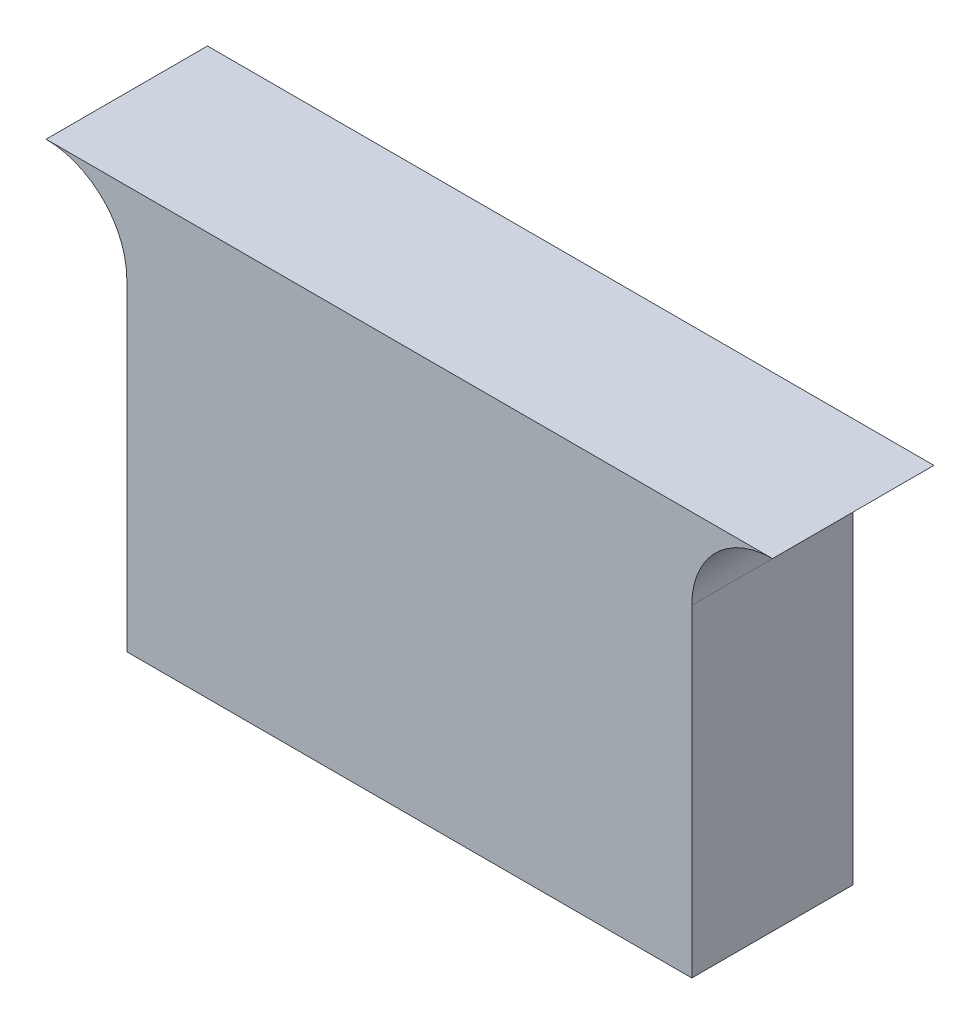
ISO-10303-21;
HEADER;
FILE_DESCRIPTION(('STEP AP214'),'2;1');
FILE_NAME('part.step','',(''),(''),'','','');
FILE_SCHEMA(('AUTOMOTIVE_DESIGN { 1 0 10303 214 1 1 1 1 }'));
ENDSEC;
DATA;
#1=APPLICATION_CONTEXT('core data for automotive mechanical design processes');
#2=APPLICATION_PROTOCOL_DEFINITION('international standard','automotive_design',2000,#1);
#3=PRODUCT_CONTEXT('',#1,'mechanical');
#4=PRODUCT('Part','Part','',(#3));
#5=PRODUCT_RELATED_PRODUCT_CATEGORY('part','',(#4));
#6=PRODUCT_DEFINITION_FORMATION('','',#4);
#7=PRODUCT_DEFINITION_CONTEXT('part definition',#1,'design');
#8=PRODUCT_DEFINITION('design','',#6,#7);
#9=PRODUCT_DEFINITION_SHAPE('','',#8);
#10=(LENGTH_UNIT() NAMED_UNIT(*) SI_UNIT(.MILLI.,.METRE.));
#11=(NAMED_UNIT(*) PLANE_ANGLE_UNIT() SI_UNIT($,.RADIAN.));
#12=(NAMED_UNIT(*) SI_UNIT($,.STERADIAN.) SOLID_ANGLE_UNIT());
#13=UNCERTAINTY_MEASURE_WITH_UNIT(LENGTH_MEASURE(1.E-05),#10,'distance_accuracy_value','');
#14=(GEOMETRIC_REPRESENTATION_CONTEXT(3) GLOBAL_UNCERTAINTY_ASSIGNED_CONTEXT((#13)) GLOBAL_UNIT_ASSIGNED_CONTEXT((#10,
#11,#12)) REPRESENTATION_CONTEXT('',''));
#15=CARTESIAN_POINT('',(0.,0.,0.));
#16=DIRECTION('',(0.,0.,1.));
#17=DIRECTION('',(1.,0.,0.));
#18=AXIS2_PLACEMENT_3D('',#15,#16,#17);
#19=CARTESIAN_POINT('',(0.,2.00000000000001,4.));
#20=DIRECTION('',(0.,-1.,0.));
#21=DIRECTION('',(1.,0.,0.));
#22=AXIS2_PLACEMENT_3D('',#19,#20,#21);
#23=PLANE('',#22);
#24=DIRECTION('',(-1.,0.,0.));
#25=VECTOR('',#24,1.);
#26=CARTESIAN_POINT('',(0.,2.00000000000001,0.));
#27=LINE('',#26,#25);
#28=CARTESIAN_POINT('',(0.,2.00000000000001,0.));
#29=VERTEX_POINT('',#28);
#30=CARTESIAN_POINT('',(-18.,2.,0.));
#31=VERTEX_POINT('',#30);
#32=EDGE_CURVE('E117',#29,#31,#27,.T.);
#33=ORIENTED_EDGE('',*,*,#32,.T.);
#34=DIRECTION('',(0.,0.,-1.));
#35=VECTOR('',#34,1.);
#36=CARTESIAN_POINT('',(-18.,2.,4.));
#37=LINE('',#36,#35);
#38=CARTESIAN_POINT('',(-18.,2.,4.));
#39=VERTEX_POINT('',#38);
#40=EDGE_CURVE('E11',#39,#31,#37,.T.);
#41=ORIENTED_EDGE('',*,*,#40,.F.);
#42=DIRECTION('',(-1.,0.,0.));
#43=VECTOR('',#42,1.);
#44=CARTESIAN_POINT('',(0.,2.00000000000001,4.));
#45=LINE('',#44,#43);
#46=CARTESIAN_POINT('',(0.,2.00000000000001,4.));
#47=VERTEX_POINT('',#46);
#48=EDGE_CURVE('E130',#47,#39,#45,.T.);
#49=ORIENTED_EDGE('',*,*,#48,.F.);
#50=DIRECTION('',(0.,0.,-1.));
#51=VECTOR('',#50,1.);
#52=CARTESIAN_POINT('',(0.,2.00000000000001,4.));
#53=LINE('',#52,#51);
#54=EDGE_CURVE('E49',#47,#29,#53,.T.);
#55=ORIENTED_EDGE('',*,*,#54,.T.);
#56=EDGE_LOOP('',(#33,#41,#49,#55));
#57=FACE_BOUND('',#56,.T.);
#58=ADVANCED_FACE('F33',(#57),#23,.F.);
#59=CARTESIAN_POINT('',(-18.,0.,4.));
#60=DIRECTION('',(0.,0.,-1.));
#61=DIRECTION('',(-1.,0.,0.));
#62=AXIS2_PLACEMENT_3D('',#59,#60,#61);
#63=CYLINDRICAL_SURFACE('',#62,2.);
#64=CARTESIAN_POINT('',(-18.,0.,0.));
#65=DIRECTION('',(0.,0.,-1.));
#66=DIRECTION('',(-1.,0.,0.));
#67=AXIS2_PLACEMENT_3D('',#64,#65,#66);
#68=CIRCLE('',#67,2.);
#69=CARTESIAN_POINT('',(-16.,0.,0.));
#70=VERTEX_POINT('',#69);
#71=EDGE_CURVE('E119',#31,#70,#68,.T.);
#72=ORIENTED_EDGE('',*,*,#71,.T.);
#73=DIRECTION('',(0.,0.,-1.));
#74=VECTOR('',#73,1.);
#75=CARTESIAN_POINT('',(-16.,0.,4.));
#76=LINE('',#75,#74);
#77=CARTESIAN_POINT('',(-16.,0.,4.));
#78=VERTEX_POINT('',#77);
#79=EDGE_CURVE('E41',#78,#70,#76,.T.);
#80=ORIENTED_EDGE('',*,*,#79,.F.);
#81=CARTESIAN_POINT('',(-18.,0.,4.));
#82=DIRECTION('',(0.,0.,-1.));
#83=DIRECTION('',(-1.,0.,0.));
#84=AXIS2_PLACEMENT_3D('',#81,#82,#83);
#85=CIRCLE('',#84,2.);
#86=EDGE_CURVE('E81',#39,#78,#85,.T.);
#87=ORIENTED_EDGE('',*,*,#86,.F.);
#88=ORIENTED_EDGE('',*,*,#40,.T.);
#89=EDGE_LOOP('',(#72,#80,#87,#88));
#90=FACE_BOUND('',#89,.T.);
#91=ADVANCED_FACE('F150',(#90),#63,.F.);
#92=CARTESIAN_POINT('',(-16.,0.,4.));
#93=DIRECTION('',(1.,0.,0.));
#94=DIRECTION('',(0.,0.,-1.));
#95=AXIS2_PLACEMENT_3D('',#92,#93,#94);
#96=PLANE('',#95);
#97=DIRECTION('',(0.,-1.,0.));
#98=VECTOR('',#97,1.);
#99=CARTESIAN_POINT('',(-16.,0.,0.));
#100=LINE('',#99,#98);
#101=CARTESIAN_POINT('',(-16.,-8.,0.));
#102=VERTEX_POINT('',#101);
#103=EDGE_CURVE('E121',#70,#102,#100,.T.);
#104=ORIENTED_EDGE('',*,*,#103,.T.);
#105=DIRECTION('',(0.,0.,-1.));
#106=VECTOR('',#105,1.);
#107=CARTESIAN_POINT('',(-16.,-8.,4.));
#108=LINE('',#107,#106);
#109=CARTESIAN_POINT('',(-16.,-8.,4.));
#110=VERTEX_POINT('',#109);
#111=EDGE_CURVE('E100',#110,#102,#108,.T.);
#112=ORIENTED_EDGE('',*,*,#111,.F.);
#113=DIRECTION('',(0.,-1.,0.));
#114=VECTOR('',#113,1.);
#115=CARTESIAN_POINT('',(-16.,0.,4.));
#116=LINE('',#115,#114);
#117=EDGE_CURVE('E108',#78,#110,#116,.T.);
#118=ORIENTED_EDGE('',*,*,#117,.F.);
#119=ORIENTED_EDGE('',*,*,#79,.T.);
#120=EDGE_LOOP('',(#104,#112,#118,#119));
#121=FACE_BOUND('',#120,.T.);
#122=ADVANCED_FACE('F136',(#121),#96,.F.);
#123=CARTESIAN_POINT('',(-2.,-8.,4.));
#124=DIRECTION('',(0.,-1.,0.));
#125=DIRECTION('',(1.,0.,0.));
#126=AXIS2_PLACEMENT_3D('',#123,#124,#125);
#127=PLANE('',#126);
#128=DIRECTION('',(-1.,0.,0.));
#129=VECTOR('',#128,1.);
#130=CARTESIAN_POINT('',(-2.,-8.,0.));
#131=LINE('',#130,#129);
#132=CARTESIAN_POINT('',(-2.,-8.,0.));
#133=VERTEX_POINT('',#132);
#134=EDGE_CURVE('E96',#133,#102,#131,.T.);
#135=ORIENTED_EDGE('',*,*,#134,.F.);
#136=DIRECTION('',(0.,0.,-1.));
#137=VECTOR('',#136,1.);
#138=CARTESIAN_POINT('',(-2.,-8.,4.));
#139=LINE('',#138,#137);
#140=CARTESIAN_POINT('',(-2.,-8.,4.));
#141=VERTEX_POINT('',#140);
#142=EDGE_CURVE('E91',#141,#133,#139,.T.);
#143=ORIENTED_EDGE('',*,*,#142,.F.);
#144=DIRECTION('',(-1.,0.,0.));
#145=VECTOR('',#144,1.);
#146=CARTESIAN_POINT('',(-2.,-8.,4.));
#147=LINE('',#146,#145);
#148=EDGE_CURVE('E94',#141,#110,#147,.T.);
#149=ORIENTED_EDGE('',*,*,#148,.T.);
#150=ORIENTED_EDGE('',*,*,#111,.T.);
#151=EDGE_LOOP('',(#135,#143,#149,#150));
#152=FACE_BOUND('',#151,.T.);
#153=ADVANCED_FACE('F93',(#152),#127,.T.);
#154=CARTESIAN_POINT('',(-2.00000000000001,0.,4.));
#155=DIRECTION('',(1.,0.,0.));
#156=DIRECTION('',(0.,1.,0.));
#157=AXIS2_PLACEMENT_3D('',#154,#155,#156);
#158=PLANE('',#157);
#159=DIRECTION('',(0.,-1.,0.));
#160=VECTOR('',#159,1.);
#161=CARTESIAN_POINT('',(-2.00000000000001,0.,0.));
#162=LINE('',#161,#160);
#163=CARTESIAN_POINT('',(-2.00000000000001,0.,0.));
#164=VERTEX_POINT('',#163);
#165=EDGE_CURVE('E125',#164,#133,#162,.T.);
#166=ORIENTED_EDGE('',*,*,#165,.F.);
#167=DIRECTION('',(0.,0.,-1.));
#168=VECTOR('',#167,1.);
#169=CARTESIAN_POINT('',(-2.00000000000001,0.,4.));
#170=LINE('',#169,#168);
#171=CARTESIAN_POINT('',(-2.00000000000001,0.,4.));
#172=VERTEX_POINT('',#171);
#173=EDGE_CURVE('E69',#172,#164,#170,.T.);
#174=ORIENTED_EDGE('',*,*,#173,.F.);
#175=DIRECTION('',(0.,-1.,0.));
#176=VECTOR('',#175,1.);
#177=CARTESIAN_POINT('',(-2.00000000000001,0.,4.));
#178=LINE('',#177,#176);
#179=EDGE_CURVE('E106',#172,#141,#178,.T.);
#180=ORIENTED_EDGE('',*,*,#179,.T.);
#181=ORIENTED_EDGE('',*,*,#142,.T.);
#182=EDGE_LOOP('',(#166,#174,#180,#181));
#183=FACE_BOUND('',#182,.T.);
#184=ADVANCED_FACE('F111',(#183),#158,.T.);
#185=CARTESIAN_POINT('',(0.,0.,4.));
#186=DIRECTION('',(0.,0.,-1.));
#187=DIRECTION('',(-1.,0.,0.));
#188=AXIS2_PLACEMENT_3D('',#185,#186,#187);
#189=CYLINDRICAL_SURFACE('',#188,2.00000000000001);
#190=CARTESIAN_POINT('',(0.,0.,0.));
#191=DIRECTION('',(0.,0.,1.));
#192=DIRECTION('',(1.,0.,0.));
#193=AXIS2_PLACEMENT_3D('',#190,#191,#192);
#194=CIRCLE('',#193,2.00000000000001);
#195=EDGE_CURVE('E127',#29,#164,#194,.T.);
#196=ORIENTED_EDGE('',*,*,#195,.F.);
#197=ORIENTED_EDGE('',*,*,#54,.F.);
#198=CARTESIAN_POINT('',(0.,0.,4.));
#199=DIRECTION('',(0.,0.,1.));
#200=DIRECTION('',(1.,0.,0.));
#201=AXIS2_PLACEMENT_3D('',#198,#199,#200);
#202=CIRCLE('',#201,2.00000000000001);
#203=EDGE_CURVE('E112',#47,#172,#202,.T.);
#204=ORIENTED_EDGE('',*,*,#203,.T.);
#205=ORIENTED_EDGE('',*,*,#173,.T.);
#206=EDGE_LOOP('',(#196,#197,#204,#205));
#207=FACE_BOUND('',#206,.T.);
#208=ADVANCED_FACE('F139',(#207),#189,.F.);
#209=CARTESIAN_POINT('',(-18.,0.,4.));
#210=DIRECTION('',(0.,0.,-1.));
#211=DIRECTION('',(-1.,0.,0.));
#212=AXIS2_PLACEMENT_3D('',#209,#210,#211);
#213=PLANE('',#212);
#214=ORIENTED_EDGE('',*,*,#48,.T.);
#215=ORIENTED_EDGE('',*,*,#86,.T.);
#216=ORIENTED_EDGE('',*,*,#117,.T.);
#217=ORIENTED_EDGE('',*,*,#148,.F.);
#218=ORIENTED_EDGE('',*,*,#179,.F.);
#219=ORIENTED_EDGE('',*,*,#203,.F.);
#220=EDGE_LOOP('',(#214,#215,#216,#217,#218,#219));
#221=FACE_BOUND('',#220,.T.);
#222=ADVANCED_FACE('F104',(#221),#213,.F.);
#223=CARTESIAN_POINT('',(-18.,0.,0.));
#224=DIRECTION('',(0.,0.,-1.));
#225=DIRECTION('',(-1.,0.,0.));
#226=AXIS2_PLACEMENT_3D('',#223,#224,#225);
#227=PLANE('',#226);
#228=ORIENTED_EDGE('',*,*,#32,.F.);
#229=ORIENTED_EDGE('',*,*,#195,.T.);
#230=ORIENTED_EDGE('',*,*,#165,.T.);
#231=ORIENTED_EDGE('',*,*,#134,.T.);
#232=ORIENTED_EDGE('',*,*,#103,.F.);
#233=ORIENTED_EDGE('',*,*,#71,.F.);
#234=EDGE_LOOP('',(#228,#229,#230,#231,#232,#233));
#235=FACE_BOUND('',#234,.T.);
#236=ADVANCED_FACE('F138',(#235),#227,.T.);
#237=CLOSED_SHELL('',(#58,#91,#122,#153,#184,#208,#222,#236));
#238=MANIFOLD_SOLID_BREP('B2',#237);
#239=ADVANCED_BREP_SHAPE_REPRESENTATION('',(#18,#238),#14);
#240=SHAPE_DEFINITION_REPRESENTATION(#9,#239);
ENDSEC;
END-ISO-10303-21;
